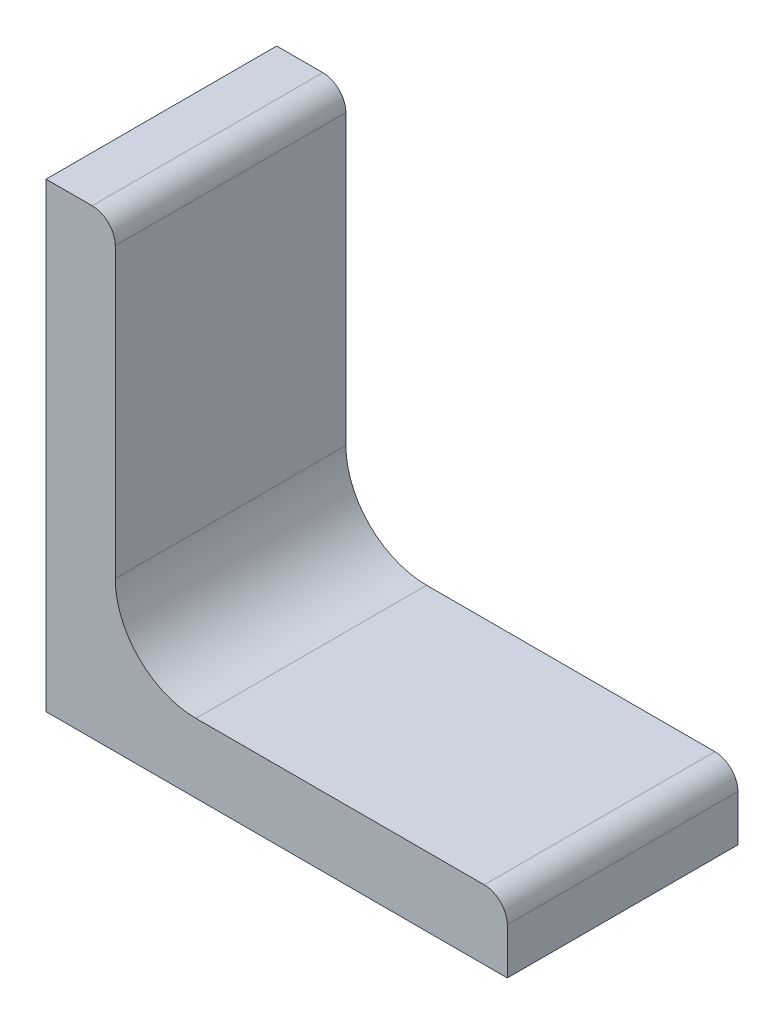
ISO-10303-21;
HEADER;
FILE_DESCRIPTION(('STEP AP214'),'2;1');
FILE_NAME('part.step','',(''),(''),'','','');
FILE_SCHEMA(('AUTOMOTIVE_DESIGN { 1 0 10303 214 1 1 1 1 }'));
ENDSEC;
DATA;
#1=APPLICATION_CONTEXT('core data for automotive mechanical design processes');
#2=APPLICATION_PROTOCOL_DEFINITION('international standard','automotive_design',2000,#1);
#3=PRODUCT_CONTEXT('',#1,'mechanical');
#4=PRODUCT('Part','Part','',(#3));
#5=PRODUCT_RELATED_PRODUCT_CATEGORY('part','',(#4));
#6=PRODUCT_DEFINITION_FORMATION('','',#4);
#7=PRODUCT_DEFINITION_CONTEXT('part definition',#1,'design');
#8=PRODUCT_DEFINITION('design','',#6,#7);
#9=PRODUCT_DEFINITION_SHAPE('','',#8);
#10=(LENGTH_UNIT() NAMED_UNIT(*) SI_UNIT(.MILLI.,.METRE.));
#11=(NAMED_UNIT(*) PLANE_ANGLE_UNIT() SI_UNIT($,.RADIAN.));
#12=(NAMED_UNIT(*) SI_UNIT($,.STERADIAN.) SOLID_ANGLE_UNIT());
#13=UNCERTAINTY_MEASURE_WITH_UNIT(LENGTH_MEASURE(1.E-05),#10,'distance_accuracy_value','');
#14=(GEOMETRIC_REPRESENTATION_CONTEXT(3) GLOBAL_UNCERTAINTY_ASSIGNED_CONTEXT((#13)) GLOBAL_UNIT_ASSIGNED_CONTEXT((#10,
#11,#12)) REPRESENTATION_CONTEXT('',''));
#15=CARTESIAN_POINT('',(0.,0.,0.));
#16=DIRECTION('',(0.,0.,1.));
#17=DIRECTION('',(1.,0.,0.));
#18=AXIS2_PLACEMENT_3D('',#15,#16,#17);
#19=CARTESIAN_POINT('',(3.,20.,10.));
#20=DIRECTION('',(0.,1.,0.));
#21=DIRECTION('',(0.,0.,1.));
#22=AXIS2_PLACEMENT_3D('',#19,#20,#21);
#23=PLANE('',#22);
#24=DIRECTION('',(1.,0.,0.));
#25=VECTOR('',#24,1.);
#26=CARTESIAN_POINT('',(3.,20.,10.));
#27=LINE('',#26,#25);
#28=CARTESIAN_POINT('',(0.,20.,10.));
#29=VERTEX_POINT('',#28);
#30=CARTESIAN_POINT('',(2.,20.,10.));
#31=VERTEX_POINT('',#30);
#32=EDGE_CURVE('E148',#29,#31,#27,.T.);
#33=ORIENTED_EDGE('',*,*,#32,.T.);
#34=DIRECTION('',(0.,0.,-1.));
#35=VECTOR('',#34,1.);
#36=CARTESIAN_POINT('',(2.,20.,10.));
#37=LINE('',#36,#35);
#38=CARTESIAN_POINT('',(2.,20.,0.));
#39=VERTEX_POINT('',#38);
#40=EDGE_CURVE('E164',#31,#39,#37,.T.);
#41=ORIENTED_EDGE('',*,*,#40,.T.);
#42=DIRECTION('',(1.,0.,0.));
#43=VECTOR('',#42,1.);
#44=CARTESIAN_POINT('',(3.,20.,0.));
#45=LINE('',#44,#43);
#46=CARTESIAN_POINT('',(0.,20.,0.));
#47=VERTEX_POINT('',#46);
#48=EDGE_CURVE('E135',#47,#39,#45,.T.);
#49=ORIENTED_EDGE('',*,*,#48,.F.);
#50=DIRECTION('',(0.,0.,-1.));
#51=VECTOR('',#50,1.);
#52=CARTESIAN_POINT('',(0.,20.,10.));
#53=LINE('',#52,#51);
#54=EDGE_CURVE('E149',#29,#47,#53,.T.);
#55=ORIENTED_EDGE('',*,*,#54,.F.);
#56=EDGE_LOOP('',(#33,#41,#49,#55));
#57=FACE_BOUND('',#56,.T.);
#58=ADVANCED_FACE('F35',(#57),#23,.T.);
#59=CARTESIAN_POINT('',(0.,20.,10.));
#60=DIRECTION('',(-1.,0.,0.));
#61=DIRECTION('',(0.,-1.,0.));
#62=AXIS2_PLACEMENT_3D('',#59,#60,#61);
#63=PLANE('',#62);
#64=DIRECTION('',(0.,1.,0.));
#65=VECTOR('',#64,1.);
#66=CARTESIAN_POINT('',(0.,20.,0.));
#67=LINE('',#66,#65);
#68=CARTESIAN_POINT('',(0.,0.,0.));
#69=VERTEX_POINT('',#68);
#70=EDGE_CURVE('E145',#69,#47,#67,.T.);
#71=ORIENTED_EDGE('',*,*,#70,.F.);
#72=DIRECTION('',(0.,0.,-1.));
#73=VECTOR('',#72,1.);
#74=CARTESIAN_POINT('',(0.,0.,10.));
#75=LINE('',#74,#73);
#76=CARTESIAN_POINT('',(0.,0.,10.));
#77=VERTEX_POINT('',#76);
#78=EDGE_CURVE('E125',#77,#69,#75,.T.);
#79=ORIENTED_EDGE('',*,*,#78,.F.);
#80=DIRECTION('',(0.,1.,0.));
#81=VECTOR('',#80,1.);
#82=CARTESIAN_POINT('',(0.,20.,10.));
#83=LINE('',#82,#81);
#84=EDGE_CURVE('E126',#77,#29,#83,.T.);
#85=ORIENTED_EDGE('',*,*,#84,.T.);
#86=ORIENTED_EDGE('',*,*,#54,.T.);
#87=EDGE_LOOP('',(#71,#79,#85,#86));
#88=FACE_BOUND('',#87,.T.);
#89=ADVANCED_FACE('F202',(#88),#63,.T.);
#90=CARTESIAN_POINT('',(0.,0.,10.));
#91=DIRECTION('',(0.,-1.,0.));
#92=DIRECTION('',(1.,0.,0.));
#93=AXIS2_PLACEMENT_3D('',#90,#91,#92);
#94=PLANE('',#93);
#95=DIRECTION('',(-1.,0.,0.));
#96=VECTOR('',#95,1.);
#97=CARTESIAN_POINT('',(0.,0.,0.));
#98=LINE('',#97,#96);
#99=CARTESIAN_POINT('',(20.,0.,0.));
#100=VERTEX_POINT('',#99);
#101=EDGE_CURVE('E124',#100,#69,#98,.T.);
#102=ORIENTED_EDGE('',*,*,#101,.F.);
#103=DIRECTION('',(0.,0.,-1.));
#104=VECTOR('',#103,1.);
#105=CARTESIAN_POINT('',(20.,0.,10.));
#106=LINE('',#105,#104);
#107=CARTESIAN_POINT('',(20.,0.,10.));
#108=VERTEX_POINT('',#107);
#109=EDGE_CURVE('E108',#108,#100,#106,.T.);
#110=ORIENTED_EDGE('',*,*,#109,.F.);
#111=DIRECTION('',(-1.,0.,0.));
#112=VECTOR('',#111,1.);
#113=CARTESIAN_POINT('',(0.,0.,10.));
#114=LINE('',#113,#112);
#115=EDGE_CURVE('E116',#108,#77,#114,.T.);
#116=ORIENTED_EDGE('',*,*,#115,.T.);
#117=ORIENTED_EDGE('',*,*,#78,.T.);
#118=EDGE_LOOP('',(#102,#110,#116,#117));
#119=FACE_BOUND('',#118,.T.);
#120=ADVANCED_FACE('F121',(#119),#94,.T.);
#121=CARTESIAN_POINT('',(20.,0.,10.));
#122=DIRECTION('',(1.,0.,0.));
#123=DIRECTION('',(0.,0.,-1.));
#124=AXIS2_PLACEMENT_3D('',#121,#122,#123);
#125=PLANE('',#124);
#126=DIRECTION('',(0.,-1.,0.));
#127=VECTOR('',#126,1.);
#128=CARTESIAN_POINT('',(20.,0.,0.));
#129=LINE('',#128,#127);
#130=CARTESIAN_POINT('',(20.,2.,0.));
#131=VERTEX_POINT('',#130);
#132=EDGE_CURVE('E142',#131,#100,#129,.T.);
#133=ORIENTED_EDGE('',*,*,#132,.F.);
#134=DIRECTION('',(0.,0.,-1.));
#135=VECTOR('',#134,1.);
#136=CARTESIAN_POINT('',(20.,2.,10.));
#137=LINE('',#136,#135);
#138=CARTESIAN_POINT('',(20.,2.,10.));
#139=VERTEX_POINT('',#138);
#140=EDGE_CURVE('E111',#131,#139,#137,.F.);
#141=ORIENTED_EDGE('',*,*,#140,.T.);
#142=DIRECTION('',(0.,-1.,0.));
#143=VECTOR('',#142,1.);
#144=CARTESIAN_POINT('',(20.,0.,10.));
#145=LINE('',#144,#143);
#146=EDGE_CURVE('E104',#139,#108,#145,.T.);
#147=ORIENTED_EDGE('',*,*,#146,.T.);
#148=ORIENTED_EDGE('',*,*,#109,.T.);
#149=EDGE_LOOP('',(#133,#141,#147,#148));
#150=FACE_BOUND('',#149,.T.);
#151=ADVANCED_FACE('F107',(#150),#125,.T.);
#152=CARTESIAN_POINT('',(20.,3.,10.));
#153=DIRECTION('',(0.,1.,0.));
#154=DIRECTION('',(-1.,0.,0.));
#155=AXIS2_PLACEMENT_3D('',#152,#153,#154);
#156=PLANE('',#155);
#157=DIRECTION('',(1.,0.,0.));
#158=VECTOR('',#157,1.);
#159=CARTESIAN_POINT('',(20.,3.,0.));
#160=LINE('',#159,#158);
#161=CARTESIAN_POINT('',(6.5,3.,0.));
#162=VERTEX_POINT('',#161);
#163=CARTESIAN_POINT('',(19.,3.,0.));
#164=VERTEX_POINT('',#163);
#165=EDGE_CURVE('E140',#162,#164,#160,.T.);
#166=ORIENTED_EDGE('',*,*,#165,.F.);
#167=DIRECTION('',(0.,0.,-1.));
#168=VECTOR('',#167,1.);
#169=CARTESIAN_POINT('',(6.5,3.,10.));
#170=LINE('',#169,#168);
#171=CARTESIAN_POINT('',(6.5,3.,10.));
#172=VERTEX_POINT('',#171);
#173=EDGE_CURVE('E56',#162,#172,#170,.F.);
#174=ORIENTED_EDGE('',*,*,#173,.T.);
#175=DIRECTION('',(1.,0.,0.));
#176=VECTOR('',#175,1.);
#177=CARTESIAN_POINT('',(20.,3.,10.));
#178=LINE('',#177,#176);
#179=CARTESIAN_POINT('',(19.,3.,10.));
#180=VERTEX_POINT('',#179);
#181=EDGE_CURVE('E117',#172,#180,#178,.T.);
#182=ORIENTED_EDGE('',*,*,#181,.T.);
#183=DIRECTION('',(0.,0.,-1.));
#184=VECTOR('',#183,1.);
#185=CARTESIAN_POINT('',(19.,3.,10.));
#186=LINE('',#185,#184);
#187=EDGE_CURVE('E151',#180,#164,#186,.T.);
#188=ORIENTED_EDGE('',*,*,#187,.T.);
#189=EDGE_LOOP('',(#166,#174,#182,#188));
#190=FACE_BOUND('',#189,.T.);
#191=ADVANCED_FACE('F192',(#190),#156,.T.);
#192=CARTESIAN_POINT('',(3.,3.,10.));
#193=DIRECTION('',(1.,0.,0.));
#194=DIRECTION('',(0.,1.,0.));
#195=AXIS2_PLACEMENT_3D('',#192,#193,#194);
#196=PLANE('',#195);
#197=DIRECTION('',(0.,-1.,0.));
#198=VECTOR('',#197,1.);
#199=CARTESIAN_POINT('',(3.,3.,10.));
#200=LINE('',#199,#198);
#201=CARTESIAN_POINT('',(3.,19.,10.));
#202=VERTEX_POINT('',#201);
#203=CARTESIAN_POINT('',(3.,6.5,10.));
#204=VERTEX_POINT('',#203);
#205=EDGE_CURVE('E179',#202,#204,#200,.T.);
#206=ORIENTED_EDGE('',*,*,#205,.T.);
#207=DIRECTION('',(0.,0.,-1.));
#208=VECTOR('',#207,1.);
#209=CARTESIAN_POINT('',(3.,6.5,0.));
#210=LINE('',#209,#208);
#211=CARTESIAN_POINT('',(3.,6.5,0.));
#212=VERTEX_POINT('',#211);
#213=EDGE_CURVE('E169',#204,#212,#210,.T.);
#214=ORIENTED_EDGE('',*,*,#213,.T.);
#215=DIRECTION('',(0.,-1.,0.));
#216=VECTOR('',#215,1.);
#217=CARTESIAN_POINT('',(3.,3.,0.));
#218=LINE('',#217,#216);
#219=CARTESIAN_POINT('',(3.,19.,0.));
#220=VERTEX_POINT('',#219);
#221=EDGE_CURVE('E138',#220,#212,#218,.T.);
#222=ORIENTED_EDGE('',*,*,#221,.F.);
#223=DIRECTION('',(0.,0.,-1.));
#224=VECTOR('',#223,1.);
#225=CARTESIAN_POINT('',(3.,19.,10.));
#226=LINE('',#225,#224);
#227=EDGE_CURVE('E167',#220,#202,#226,.F.);
#228=ORIENTED_EDGE('',*,*,#227,.T.);
#229=EDGE_LOOP('',(#206,#214,#222,#228));
#230=FACE_BOUND('',#229,.T.);
#231=ADVANCED_FACE('F176',(#230),#196,.T.);
#232=CARTESIAN_POINT('',(0.,20.,10.));
#233=DIRECTION('',(0.,0.,1.));
#234=DIRECTION('',(1.,0.,0.));
#235=AXIS2_PLACEMENT_3D('',#232,#233,#234);
#236=PLANE('',#235);
#237=ORIENTED_EDGE('',*,*,#146,.F.);
#238=CARTESIAN_POINT('',(19.,2.,10.));
#239=DIRECTION('',(0.,0.,1.));
#240=DIRECTION('',(1.,0.,0.));
#241=AXIS2_PLACEMENT_3D('',#238,#239,#240);
#242=CIRCLE('',#241,1.);
#243=EDGE_CURVE('E162',#139,#180,#242,.T.);
#244=ORIENTED_EDGE('',*,*,#243,.T.);
#245=ORIENTED_EDGE('',*,*,#181,.F.);
#246=CARTESIAN_POINT('',(6.5,6.5,10.));
#247=DIRECTION('',(0.,0.,1.));
#248=DIRECTION('',(1.,0.,0.));
#249=AXIS2_PLACEMENT_3D('',#246,#247,#248);
#250=CIRCLE('',#249,3.5);
#251=EDGE_CURVE('E11',#172,#204,#250,.F.);
#252=ORIENTED_EDGE('',*,*,#251,.T.);
#253=ORIENTED_EDGE('',*,*,#205,.F.);
#254=CARTESIAN_POINT('',(2.,19.,10.));
#255=DIRECTION('',(0.,0.,1.));
#256=DIRECTION('',(1.,0.,0.));
#257=AXIS2_PLACEMENT_3D('',#254,#255,#256);
#258=CIRCLE('',#257,1.);
#259=EDGE_CURVE('E160',#202,#31,#258,.T.);
#260=ORIENTED_EDGE('',*,*,#259,.T.);
#261=ORIENTED_EDGE('',*,*,#32,.F.);
#262=ORIENTED_EDGE('',*,*,#84,.F.);
#263=ORIENTED_EDGE('',*,*,#115,.F.);
#264=EDGE_LOOP('',(#237,#244,#245,#252,#253,#260,#261,#262,#263));
#265=FACE_BOUND('',#264,.T.);
#266=ADVANCED_FACE('F128',(#265),#236,.T.);
#267=CARTESIAN_POINT('',(0.,20.,0.));
#268=DIRECTION('',(0.,0.,1.));
#269=DIRECTION('',(1.,0.,0.));
#270=AXIS2_PLACEMENT_3D('',#267,#268,#269);
#271=PLANE('',#270);
#272=ORIENTED_EDGE('',*,*,#221,.T.);
#273=CARTESIAN_POINT('',(6.5,6.5,0.));
#274=DIRECTION('',(0.,0.,1.));
#275=DIRECTION('',(1.,0.,0.));
#276=AXIS2_PLACEMENT_3D('',#273,#274,#275);
#277=CIRCLE('',#276,3.5);
#278=EDGE_CURVE('E43',#212,#162,#277,.T.);
#279=ORIENTED_EDGE('',*,*,#278,.T.);
#280=ORIENTED_EDGE('',*,*,#165,.T.);
#281=CARTESIAN_POINT('',(19.,2.,0.));
#282=DIRECTION('',(0.,0.,1.));
#283=DIRECTION('',(1.,0.,0.));
#284=AXIS2_PLACEMENT_3D('',#281,#282,#283);
#285=CIRCLE('',#284,1.);
#286=EDGE_CURVE('E157',#164,#131,#285,.F.);
#287=ORIENTED_EDGE('',*,*,#286,.T.);
#288=ORIENTED_EDGE('',*,*,#132,.T.);
#289=ORIENTED_EDGE('',*,*,#101,.T.);
#290=ORIENTED_EDGE('',*,*,#70,.T.);
#291=ORIENTED_EDGE('',*,*,#48,.T.);
#292=CARTESIAN_POINT('',(2.,19.,0.));
#293=DIRECTION('',(0.,0.,1.));
#294=DIRECTION('',(1.,0.,0.));
#295=AXIS2_PLACEMENT_3D('',#292,#293,#294);
#296=CIRCLE('',#295,1.);
#297=EDGE_CURVE('E155',#39,#220,#296,.F.);
#298=ORIENTED_EDGE('',*,*,#297,.T.);
#299=EDGE_LOOP('',(#272,#279,#280,#287,#288,#289,#290,#291,#298));
#300=FACE_BOUND('',#299,.T.);
#301=ADVANCED_FACE('F182',(#300),#271,.F.);
#302=CARTESIAN_POINT('',(19.,2.,10.));
#303=DIRECTION('',(0.,0.,-1.));
#304=DIRECTION('',(-1.,0.,0.));
#305=AXIS2_PLACEMENT_3D('',#302,#303,#304);
#306=CYLINDRICAL_SURFACE('',#305,1.);
#307=ORIENTED_EDGE('',*,*,#243,.F.);
#308=ORIENTED_EDGE('',*,*,#140,.F.);
#309=ORIENTED_EDGE('',*,*,#286,.F.);
#310=ORIENTED_EDGE('',*,*,#187,.F.);
#311=EDGE_LOOP('',(#307,#308,#309,#310));
#312=FACE_BOUND('',#311,.T.);
#313=ADVANCED_FACE('F196',(#312),#306,.T.);
#314=CARTESIAN_POINT('',(2.,19.,10.));
#315=DIRECTION('',(0.,0.,-1.));
#316=DIRECTION('',(-1.,0.,0.));
#317=AXIS2_PLACEMENT_3D('',#314,#315,#316);
#318=CYLINDRICAL_SURFACE('',#317,1.);
#319=ORIENTED_EDGE('',*,*,#259,.F.);
#320=ORIENTED_EDGE('',*,*,#227,.F.);
#321=ORIENTED_EDGE('',*,*,#297,.F.);
#322=ORIENTED_EDGE('',*,*,#40,.F.);
#323=EDGE_LOOP('',(#319,#320,#321,#322));
#324=FACE_BOUND('',#323,.T.);
#325=ADVANCED_FACE('F187',(#324),#318,.T.);
#326=CARTESIAN_POINT('',(6.5,6.5,10.));
#327=DIRECTION('',(0.,0.,1.));
#328=DIRECTION('',(1.,0.,0.));
#329=AXIS2_PLACEMENT_3D('',#326,#327,#328);
#330=CYLINDRICAL_SURFACE('',#329,3.5);
#331=ORIENTED_EDGE('',*,*,#251,.F.);
#332=ORIENTED_EDGE('',*,*,#173,.F.);
#333=ORIENTED_EDGE('',*,*,#278,.F.);
#334=ORIENTED_EDGE('',*,*,#213,.F.);
#335=EDGE_LOOP('',(#331,#332,#333,#334));
#336=FACE_BOUND('',#335,.T.);
#337=ADVANCED_FACE('F37',(#336),#330,.F.);
#338=CLOSED_SHELL('',(#58,#89,#120,#151,#191,#231,#266,#301,#313,#325,#337));
#339=MANIFOLD_SOLID_BREP('B2',#338);
#340=ADVANCED_BREP_SHAPE_REPRESENTATION('',(#18,#339),#14);
#341=SHAPE_DEFINITION_REPRESENTATION(#9,#340);
ENDSEC;
END-ISO-10303-21;
